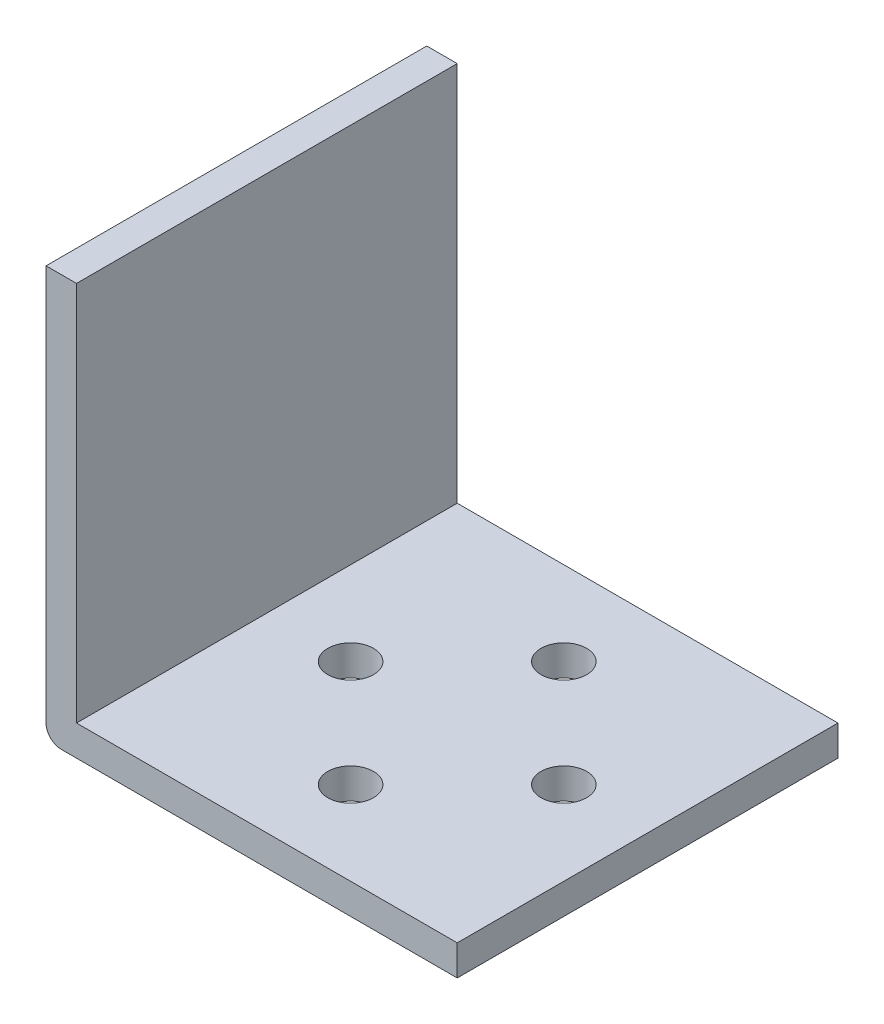
ISO-10303-21;
HEADER;
FILE_DESCRIPTION(('STEP AP214'),'2;1');
FILE_NAME('part.step','',(''),(''),'','','');
FILE_SCHEMA(('AUTOMOTIVE_DESIGN { 1 0 10303 214 1 1 1 1 }'));
ENDSEC;
DATA;
#1=APPLICATION_CONTEXT('core data for automotive mechanical design processes');
#2=APPLICATION_PROTOCOL_DEFINITION('international standard','automotive_design',2000,#1);
#3=PRODUCT_CONTEXT('',#1,'mechanical');
#4=PRODUCT('Part','Part','',(#3));
#5=PRODUCT_RELATED_PRODUCT_CATEGORY('part','',(#4));
#6=PRODUCT_DEFINITION_FORMATION('','',#4);
#7=PRODUCT_DEFINITION_CONTEXT('part definition',#1,'design');
#8=PRODUCT_DEFINITION('design','',#6,#7);
#9=PRODUCT_DEFINITION_SHAPE('','',#8);
#10=(LENGTH_UNIT() NAMED_UNIT(*) SI_UNIT(.MILLI.,.METRE.));
#11=(NAMED_UNIT(*) PLANE_ANGLE_UNIT() SI_UNIT($,.RADIAN.));
#12=(NAMED_UNIT(*) SI_UNIT($,.STERADIAN.) SOLID_ANGLE_UNIT());
#13=UNCERTAINTY_MEASURE_WITH_UNIT(LENGTH_MEASURE(1.E-05),#10,'distance_accuracy_value','');
#14=(GEOMETRIC_REPRESENTATION_CONTEXT(3) GLOBAL_UNCERTAINTY_ASSIGNED_CONTEXT((#13)) GLOBAL_UNIT_ASSIGNED_CONTEXT((#10,
#11,#12)) REPRESENTATION_CONTEXT('',''));
#15=CARTESIAN_POINT('',(0.,0.,0.));
#16=DIRECTION('',(0.,0.,1.));
#17=DIRECTION('',(1.,0.,0.));
#18=AXIS2_PLACEMENT_3D('',#15,#16,#17);
#19=CARTESIAN_POINT('',(0.,2.,0.));
#20=DIRECTION('',(0.,-1.,0.));
#21=DIRECTION('',(0.,0.,-1.));
#22=AXIS2_PLACEMENT_3D('',#19,#20,#21);
#23=PLANE('',#22);
#24=CARTESIAN_POINT('',(1.,2.,7.));
#25=DIRECTION('',(0.,-1.,0.));
#26=DIRECTION('',(0.,0.,-1.));
#27=AXIS2_PLACEMENT_3D('',#24,#25,#26);
#28=CIRCLE('',#27,1.5);
#29=CARTESIAN_POINT('',(1.,2.,5.5));
#30=VERTEX_POINT('',#29);
#31=EDGE_CURVE('E126',#30,#30,#28,.T.);
#32=ORIENTED_EDGE('',*,*,#31,.T.);
#33=EDGE_LOOP('',(#32));
#34=FACE_BOUND('',#33,.T.);
#35=CARTESIAN_POINT('',(8.,2.,0.));
#36=DIRECTION('',(0.,-1.,0.));
#37=DIRECTION('',(0.,0.,-1.));
#38=AXIS2_PLACEMENT_3D('',#35,#36,#37);
#39=CIRCLE('',#38,1.5);
#40=CARTESIAN_POINT('',(8.,2.,-1.5));
#41=VERTEX_POINT('',#40);
#42=EDGE_CURVE('E327',#41,#41,#39,.T.);
#43=ORIENTED_EDGE('',*,*,#42,.T.);
#44=EDGE_LOOP('',(#43));
#45=FACE_BOUND('',#44,.T.);
#46=CARTESIAN_POINT('',(1.,2.,-7.));
#47=DIRECTION('',(0.,-1.,0.));
#48=DIRECTION('',(0.,0.,-1.));
#49=AXIS2_PLACEMENT_3D('',#46,#47,#48);
#50=CIRCLE('',#49,1.5);
#51=CARTESIAN_POINT('',(1.,2.,-8.5));
#52=VERTEX_POINT('',#51);
#53=EDGE_CURVE('E329',#52,#52,#50,.T.);
#54=ORIENTED_EDGE('',*,*,#53,.T.);
#55=EDGE_LOOP('',(#54));
#56=FACE_BOUND('',#55,.T.);
#57=CARTESIAN_POINT('',(-6.,2.,0.));
#58=DIRECTION('',(0.,-1.,0.));
#59=DIRECTION('',(0.,0.,-1.));
#60=AXIS2_PLACEMENT_3D('',#57,#58,#59);
#61=CIRCLE('',#60,1.5);
#62=CARTESIAN_POINT('',(-6.,2.,-1.5));
#63=VERTEX_POINT('',#62);
#64=EDGE_CURVE('E332',#63,#63,#61,.T.);
#65=ORIENTED_EDGE('',*,*,#64,.T.);
#66=EDGE_LOOP('',(#65));
#67=FACE_BOUND('',#66,.T.);
#68=DIRECTION('',(0.,0.,-1.));
#69=VECTOR('',#68,1.);
#70=CARTESIAN_POINT('',(-11.5,2.,-12.5));
#71=LINE('',#70,#69);
#72=CARTESIAN_POINT('',(-11.5,2.,12.5));
#73=VERTEX_POINT('',#72);
#74=CARTESIAN_POINT('',(-11.5,2.,-12.5));
#75=VERTEX_POINT('',#74);
#76=EDGE_CURVE('E123',#73,#75,#71,.T.);
#77=ORIENTED_EDGE('',*,*,#76,.F.);
#78=DIRECTION('',(1.,0.,0.));
#79=VECTOR('',#78,1.);
#80=CARTESIAN_POINT('',(-13.5,2.,12.5));
#81=LINE('',#80,#79);
#82=CARTESIAN_POINT('',(13.5,2.,12.5));
#83=VERTEX_POINT('',#82);
#84=EDGE_CURVE('E144',#73,#83,#81,.T.);
#85=ORIENTED_EDGE('',*,*,#84,.T.);
#86=DIRECTION('',(0.,0.,-1.));
#87=VECTOR('',#86,1.);
#88=CARTESIAN_POINT('',(13.5,2.,12.5));
#89=LINE('',#88,#87);
#90=CARTESIAN_POINT('',(13.5,2.,-12.5));
#91=VERTEX_POINT('',#90);
#92=EDGE_CURVE('E138',#83,#91,#89,.T.);
#93=ORIENTED_EDGE('',*,*,#92,.T.);
#94=DIRECTION('',(-1.,0.,0.));
#95=VECTOR('',#94,1.);
#96=CARTESIAN_POINT('',(-13.5,2.,-12.5));
#97=LINE('',#96,#95);
#98=EDGE_CURVE('E141',#91,#75,#97,.T.);
#99=ORIENTED_EDGE('',*,*,#98,.T.);
#100=EDGE_LOOP('',(#77,#85,#93,#99));
#101=FACE_BOUND('',#100,.T.);
#102=ADVANCED_FACE('F41',(#34,#45,#56,#67,#101),#23,.F.);
#103=CARTESIAN_POINT('',(13.5,2.,12.5));
#104=DIRECTION('',(-1.,0.,0.));
#105=DIRECTION('',(0.,0.,1.));
#106=AXIS2_PLACEMENT_3D('',#103,#104,#105);
#107=PLANE('',#106);
#108=DIRECTION('',(0.,0.,-1.));
#109=VECTOR('',#108,1.);
#110=CARTESIAN_POINT('',(13.5,0.,12.5));
#111=LINE('',#110,#109);
#112=CARTESIAN_POINT('',(13.5,0.,12.5));
#113=VERTEX_POINT('',#112);
#114=CARTESIAN_POINT('',(13.5,0.,-12.5));
#115=VERTEX_POINT('',#114);
#116=EDGE_CURVE('E137',#113,#115,#111,.T.);
#117=ORIENTED_EDGE('',*,*,#116,.T.);
#118=DIRECTION('',(0.,-1.,0.));
#119=VECTOR('',#118,1.);
#120=CARTESIAN_POINT('',(13.5,2.,-12.5));
#121=LINE('',#120,#119);
#122=EDGE_CURVE('E154',#91,#115,#121,.T.);
#123=ORIENTED_EDGE('',*,*,#122,.F.);
#124=ORIENTED_EDGE('',*,*,#92,.F.);
#125=DIRECTION('',(0.,-1.,0.));
#126=VECTOR('',#125,1.);
#127=CARTESIAN_POINT('',(13.5,2.,12.5));
#128=LINE('',#127,#126);
#129=EDGE_CURVE('E107',#83,#113,#128,.T.);
#130=ORIENTED_EDGE('',*,*,#129,.T.);
#131=EDGE_LOOP('',(#117,#123,#124,#130));
#132=FACE_BOUND('',#131,.T.);
#133=ADVANCED_FACE('F165',(#132),#107,.F.);
#134=CARTESIAN_POINT('',(-13.5,2.,-12.5));
#135=DIRECTION('',(0.,0.,1.));
#136=DIRECTION('',(1.,0.,0.));
#137=AXIS2_PLACEMENT_3D('',#134,#135,#136);
#138=PLANE('',#137);
#139=DIRECTION('',(-1.,0.,0.));
#140=VECTOR('',#139,1.);
#141=CARTESIAN_POINT('',(-13.5,0.,-12.5));
#142=LINE('',#141,#140);
#143=CARTESIAN_POINT('',(-12.5,0.,-12.5));
#144=VERTEX_POINT('',#143);
#145=EDGE_CURVE('E148',#115,#144,#142,.T.);
#146=ORIENTED_EDGE('',*,*,#145,.T.);
#147=CARTESIAN_POINT('',(-12.5,1.,-12.5));
#148=DIRECTION('',(0.,0.,1.));
#149=DIRECTION('',(1.,0.,0.));
#150=AXIS2_PLACEMENT_3D('',#147,#148,#149);
#151=CIRCLE('',#150,1.);
#152=CARTESIAN_POINT('',(-13.5,1.,-12.5));
#153=VERTEX_POINT('',#152);
#154=EDGE_CURVE('E11',#144,#153,#151,.F.);
#155=ORIENTED_EDGE('',*,*,#154,.T.);
#156=DIRECTION('',(0.,-1.,0.));
#157=VECTOR('',#156,1.);
#158=CARTESIAN_POINT('',(-13.5,2.,-12.5));
#159=LINE('',#158,#157);
#160=CARTESIAN_POINT('',(-13.5,27.,-12.5));
#161=VERTEX_POINT('',#160);
#162=EDGE_CURVE('E106',#161,#153,#159,.T.);
#163=ORIENTED_EDGE('',*,*,#162,.F.);
#164=DIRECTION('',(-1.,0.,0.));
#165=VECTOR('',#164,1.);
#166=CARTESIAN_POINT('',(-13.5,27.,-12.5));
#167=LINE('',#166,#165);
#168=CARTESIAN_POINT('',(-11.5,27.,-12.5));
#169=VERTEX_POINT('',#168);
#170=EDGE_CURVE('E122',#169,#161,#167,.T.);
#171=ORIENTED_EDGE('',*,*,#170,.F.);
#172=DIRECTION('',(0.,-1.,0.));
#173=VECTOR('',#172,1.);
#174=CARTESIAN_POINT('',(-11.5,27.,-12.5));
#175=LINE('',#174,#173);
#176=EDGE_CURVE('E132',#169,#75,#175,.T.);
#177=ORIENTED_EDGE('',*,*,#176,.T.);
#178=ORIENTED_EDGE('',*,*,#98,.F.);
#179=ORIENTED_EDGE('',*,*,#122,.T.);
#180=EDGE_LOOP('',(#146,#155,#163,#171,#177,#178,#179));
#181=FACE_BOUND('',#180,.T.);
#182=ADVANCED_FACE('F160',(#181),#138,.F.);
#183=CARTESIAN_POINT('',(-13.5,2.,12.5));
#184=DIRECTION('',(1.,0.,0.));
#185=DIRECTION('',(0.,0.,-1.));
#186=AXIS2_PLACEMENT_3D('',#183,#184,#185);
#187=PLANE('',#186);
#188=ORIENTED_EDGE('',*,*,#162,.T.);
#189=DIRECTION('',(0.,0.,1.));
#190=VECTOR('',#189,1.);
#191=CARTESIAN_POINT('',(-13.5,1.,12.5));
#192=LINE('',#191,#190);
#193=CARTESIAN_POINT('',(-13.5,1.,12.5));
#194=VERTEX_POINT('',#193);
#195=EDGE_CURVE('E105',#153,#194,#192,.T.);
#196=ORIENTED_EDGE('',*,*,#195,.T.);
#197=DIRECTION('',(0.,-1.,0.));
#198=VECTOR('',#197,1.);
#199=CARTESIAN_POINT('',(-13.5,2.,12.5));
#200=LINE('',#199,#198);
#201=CARTESIAN_POINT('',(-13.5,27.,12.5));
#202=VERTEX_POINT('',#201);
#203=EDGE_CURVE('E98',#202,#194,#200,.T.);
#204=ORIENTED_EDGE('',*,*,#203,.F.);
#205=DIRECTION('',(0.,0.,1.));
#206=VECTOR('',#205,1.);
#207=CARTESIAN_POINT('',(-13.5,27.,-12.5));
#208=LINE('',#207,#206);
#209=EDGE_CURVE('E103',#161,#202,#208,.T.);
#210=ORIENTED_EDGE('',*,*,#209,.F.);
#211=EDGE_LOOP('',(#188,#196,#204,#210));
#212=FACE_BOUND('',#211,.T.);
#213=ADVANCED_FACE('F101',(#212),#187,.F.);
#214=CARTESIAN_POINT('',(-13.5,2.,12.5));
#215=DIRECTION('',(0.,0.,-1.));
#216=DIRECTION('',(-1.,0.,0.));
#217=AXIS2_PLACEMENT_3D('',#214,#215,#216);
#218=PLANE('',#217);
#219=ORIENTED_EDGE('',*,*,#203,.T.);
#220=CARTESIAN_POINT('',(-12.5,1.,12.5));
#221=DIRECTION('',(0.,0.,-1.));
#222=DIRECTION('',(-1.,0.,0.));
#223=AXIS2_PLACEMENT_3D('',#220,#221,#222);
#224=CIRCLE('',#223,1.);
#225=CARTESIAN_POINT('',(-12.5,0.,12.5));
#226=VERTEX_POINT('',#225);
#227=EDGE_CURVE('E63',#194,#226,#224,.F.);
#228=ORIENTED_EDGE('',*,*,#227,.T.);
#229=DIRECTION('',(1.,0.,0.));
#230=VECTOR('',#229,1.);
#231=CARTESIAN_POINT('',(-13.5,0.,12.5));
#232=LINE('',#231,#230);
#233=EDGE_CURVE('E142',#226,#113,#232,.T.);
#234=ORIENTED_EDGE('',*,*,#233,.T.);
#235=ORIENTED_EDGE('',*,*,#129,.F.);
#236=ORIENTED_EDGE('',*,*,#84,.F.);
#237=DIRECTION('',(0.,-1.,0.));
#238=VECTOR('',#237,1.);
#239=CARTESIAN_POINT('',(-11.5,27.,12.5));
#240=LINE('',#239,#238);
#241=CARTESIAN_POINT('',(-11.5,27.,12.5));
#242=VERTEX_POINT('',#241);
#243=EDGE_CURVE('E114',#242,#73,#240,.T.);
#244=ORIENTED_EDGE('',*,*,#243,.F.);
#245=DIRECTION('',(1.,0.,0.));
#246=VECTOR('',#245,1.);
#247=CARTESIAN_POINT('',(-13.5,27.,12.5));
#248=LINE('',#247,#246);
#249=EDGE_CURVE('E110',#202,#242,#248,.T.);
#250=ORIENTED_EDGE('',*,*,#249,.F.);
#251=EDGE_LOOP('',(#219,#228,#234,#235,#236,#244,#250));
#252=FACE_BOUND('',#251,.T.);
#253=ADVANCED_FACE('F111',(#252),#218,.F.);
#254=CARTESIAN_POINT('',(0.,0.,0.));
#255=DIRECTION('',(0.,-1.,0.));
#256=DIRECTION('',(0.,0.,-1.));
#257=AXIS2_PLACEMENT_3D('',#254,#255,#256);
#258=PLANE('',#257);
#259=CARTESIAN_POINT('',(1.,0.,7.));
#260=DIRECTION('',(0.,-1.,0.));
#261=DIRECTION('',(0.,0.,-1.));
#262=AXIS2_PLACEMENT_3D('',#259,#260,#261);
#263=CIRCLE('',#262,1.5);
#264=CARTESIAN_POINT('',(1.,0.,5.5));
#265=VERTEX_POINT('',#264);
#266=EDGE_CURVE('E325',#265,#265,#263,.T.);
#267=ORIENTED_EDGE('',*,*,#266,.F.);
#268=EDGE_LOOP('',(#267));
#269=FACE_BOUND('',#268,.T.);
#270=CARTESIAN_POINT('',(8.,0.,0.));
#271=DIRECTION('',(0.,-1.,0.));
#272=DIRECTION('',(0.,0.,-1.));
#273=AXIS2_PLACEMENT_3D('',#270,#271,#272);
#274=CIRCLE('',#273,1.5);
#275=CARTESIAN_POINT('',(8.,0.,-1.5));
#276=VERTEX_POINT('',#275);
#277=EDGE_CURVE('E343',#276,#276,#274,.T.);
#278=ORIENTED_EDGE('',*,*,#277,.F.);
#279=EDGE_LOOP('',(#278));
#280=FACE_BOUND('',#279,.T.);
#281=CARTESIAN_POINT('',(1.,0.,-7.));
#282=DIRECTION('',(0.,-1.,0.));
#283=DIRECTION('',(0.,0.,-1.));
#284=AXIS2_PLACEMENT_3D('',#281,#282,#283);
#285=CIRCLE('',#284,1.5);
#286=CARTESIAN_POINT('',(1.,0.,-8.5));
#287=VERTEX_POINT('',#286);
#288=EDGE_CURVE('E340',#287,#287,#285,.T.);
#289=ORIENTED_EDGE('',*,*,#288,.F.);
#290=EDGE_LOOP('',(#289));
#291=FACE_BOUND('',#290,.T.);
#292=CARTESIAN_POINT('',(-6.,0.,0.));
#293=DIRECTION('',(0.,-1.,0.));
#294=DIRECTION('',(0.,0.,-1.));
#295=AXIS2_PLACEMENT_3D('',#292,#293,#294);
#296=CIRCLE('',#295,1.5);
#297=CARTESIAN_POINT('',(-6.,0.,-1.5));
#298=VERTEX_POINT('',#297);
#299=EDGE_CURVE('E337',#298,#298,#296,.T.);
#300=ORIENTED_EDGE('',*,*,#299,.F.);
#301=EDGE_LOOP('',(#300));
#302=FACE_BOUND('',#301,.T.);
#303=ORIENTED_EDGE('',*,*,#233,.F.);
#304=DIRECTION('',(0.,0.,1.));
#305=VECTOR('',#304,1.);
#306=CARTESIAN_POINT('',(-12.5,0.,-12.5));
#307=LINE('',#306,#305);
#308=EDGE_CURVE('E49',#226,#144,#307,.F.);
#309=ORIENTED_EDGE('',*,*,#308,.T.);
#310=ORIENTED_EDGE('',*,*,#145,.F.);
#311=ORIENTED_EDGE('',*,*,#116,.F.);
#312=EDGE_LOOP('',(#303,#309,#310,#311));
#313=FACE_BOUND('',#312,.T.);
#314=ADVANCED_FACE('F167',(#269,#280,#291,#302,#313),#258,.T.);
#315=CARTESIAN_POINT('',(-11.5,27.,-12.5));
#316=DIRECTION('',(-1.,0.,0.));
#317=DIRECTION('',(0.,0.,1.));
#318=AXIS2_PLACEMENT_3D('',#315,#316,#317);
#319=PLANE('',#318);
#320=ORIENTED_EDGE('',*,*,#76,.T.);
#321=ORIENTED_EDGE('',*,*,#176,.F.);
#322=DIRECTION('',(0.,0.,-1.));
#323=VECTOR('',#322,1.);
#324=CARTESIAN_POINT('',(-11.5,27.,-12.5));
#325=LINE('',#324,#323);
#326=EDGE_CURVE('E117',#242,#169,#325,.T.);
#327=ORIENTED_EDGE('',*,*,#326,.F.);
#328=ORIENTED_EDGE('',*,*,#243,.T.);
#329=EDGE_LOOP('',(#320,#321,#327,#328));
#330=FACE_BOUND('',#329,.T.);
#331=ADVANCED_FACE('F171',(#330),#319,.F.);
#332=CARTESIAN_POINT('',(0.,27.,0.));
#333=DIRECTION('',(0.,1.,0.));
#334=DIRECTION('',(0.,0.,1.));
#335=AXIS2_PLACEMENT_3D('',#332,#333,#334);
#336=PLANE('',#335);
#337=ORIENTED_EDGE('',*,*,#209,.T.);
#338=ORIENTED_EDGE('',*,*,#249,.T.);
#339=ORIENTED_EDGE('',*,*,#326,.T.);
#340=ORIENTED_EDGE('',*,*,#170,.T.);
#341=EDGE_LOOP('',(#337,#338,#339,#340));
#342=FACE_BOUND('',#341,.T.);
#343=ADVANCED_FACE('F120',(#342),#336,.T.);
#344=CARTESIAN_POINT('',(-6.,27.,0.));
#345=DIRECTION('',(0.,-1.,0.));
#346=DIRECTION('',(0.,0.,-1.));
#347=AXIS2_PLACEMENT_3D('',#344,#345,#346);
#348=CYLINDRICAL_SURFACE('',#347,1.5);
#349=ORIENTED_EDGE('',*,*,#299,.T.);
#350=EDGE_LOOP('',(#349));
#351=FACE_BOUND('',#350,.T.);
#352=ORIENTED_EDGE('',*,*,#64,.F.);
#353=EDGE_LOOP('',(#352));
#354=FACE_BOUND('',#353,.T.);
#355=ADVANCED_FACE('F221',(#351,#354),#348,.F.);
#356=CARTESIAN_POINT('',(1.,27.,-7.));
#357=DIRECTION('',(0.,-1.,0.));
#358=DIRECTION('',(0.,0.,-1.));
#359=AXIS2_PLACEMENT_3D('',#356,#357,#358);
#360=CYLINDRICAL_SURFACE('',#359,1.5);
#361=ORIENTED_EDGE('',*,*,#288,.T.);
#362=EDGE_LOOP('',(#361));
#363=FACE_BOUND('',#362,.T.);
#364=ORIENTED_EDGE('',*,*,#53,.F.);
#365=EDGE_LOOP('',(#364));
#366=FACE_BOUND('',#365,.T.);
#367=ADVANCED_FACE('F227',(#363,#366),#360,.F.);
#368=CARTESIAN_POINT('',(8.,27.,0.));
#369=DIRECTION('',(0.,-1.,0.));
#370=DIRECTION('',(0.,0.,-1.));
#371=AXIS2_PLACEMENT_3D('',#368,#369,#370);
#372=CYLINDRICAL_SURFACE('',#371,1.5);
#373=ORIENTED_EDGE('',*,*,#277,.T.);
#374=EDGE_LOOP('',(#373));
#375=FACE_BOUND('',#374,.T.);
#376=ORIENTED_EDGE('',*,*,#42,.F.);
#377=EDGE_LOOP('',(#376));
#378=FACE_BOUND('',#377,.T.);
#379=ADVANCED_FACE('F235',(#375,#378),#372,.F.);
#380=CARTESIAN_POINT('',(1.,27.,7.));
#381=DIRECTION('',(0.,-1.,0.));
#382=DIRECTION('',(0.,0.,-1.));
#383=AXIS2_PLACEMENT_3D('',#380,#381,#382);
#384=CYLINDRICAL_SURFACE('',#383,1.5);
#385=ORIENTED_EDGE('',*,*,#266,.T.);
#386=EDGE_LOOP('',(#385));
#387=FACE_BOUND('',#386,.T.);
#388=ORIENTED_EDGE('',*,*,#31,.F.);
#389=EDGE_LOOP('',(#388));
#390=FACE_BOUND('',#389,.T.);
#391=ADVANCED_FACE('F243',(#387,#390),#384,.F.);
#392=CARTESIAN_POINT('',(-12.5,1.,12.5));
#393=DIRECTION('',(0.,0.,-1.));
#394=DIRECTION('',(-1.,0.,0.));
#395=AXIS2_PLACEMENT_3D('',#392,#393,#394);
#396=CYLINDRICAL_SURFACE('',#395,1.);
#397=ORIENTED_EDGE('',*,*,#154,.F.);
#398=ORIENTED_EDGE('',*,*,#308,.F.);
#399=ORIENTED_EDGE('',*,*,#227,.F.);
#400=ORIENTED_EDGE('',*,*,#195,.F.);
#401=EDGE_LOOP('',(#397,#398,#399,#400));
#402=FACE_BOUND('',#401,.T.);
#403=ADVANCED_FACE('F43',(#402),#396,.T.);
#404=CLOSED_SHELL('',(#102,#133,#182,#213,#253,#314,#331,#343,#355,#367,#379,#391,#403));
#405=MANIFOLD_SOLID_BREP('B2',#404);
#406=ADVANCED_BREP_SHAPE_REPRESENTATION('',(#18,#405),#14);
#407=SHAPE_DEFINITION_REPRESENTATION(#9,#406);
ENDSEC;
END-ISO-10303-21;
